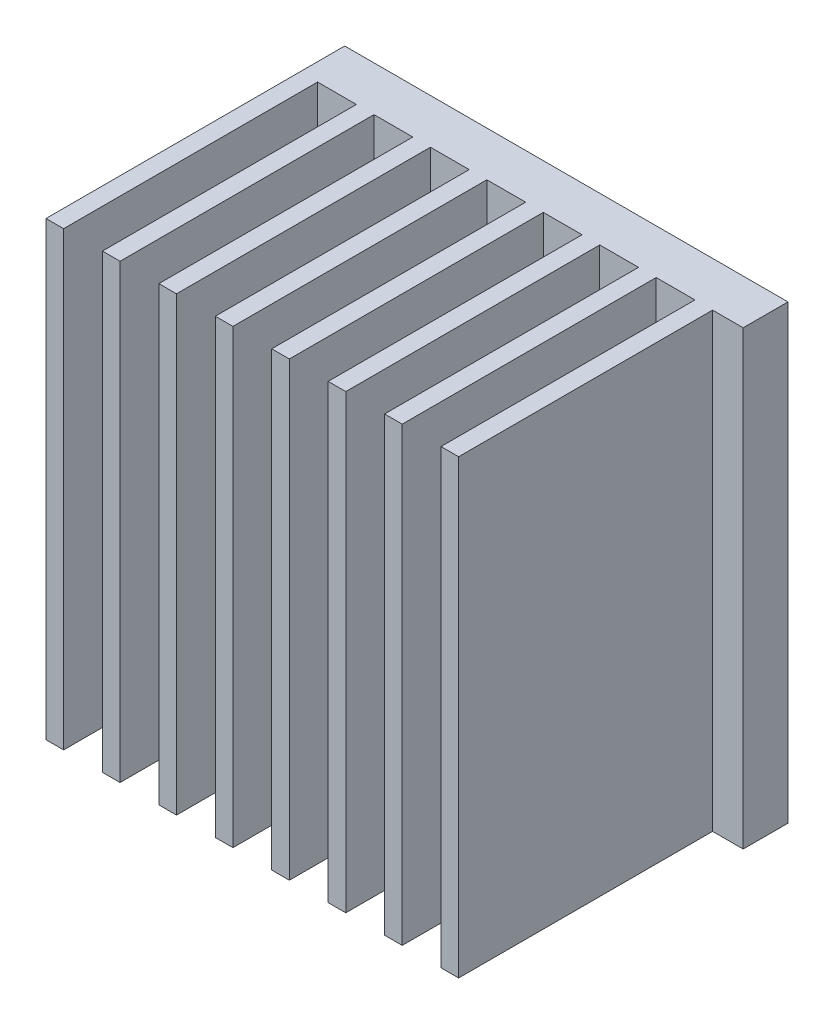
ISO-10303-21;
HEADER;
FILE_DESCRIPTION(('STEP AP214'),'2;1');
FILE_NAME('part.step','',(''),(''),'','','');
FILE_SCHEMA(('AUTOMOTIVE_DESIGN { 1 0 10303 214 1 1 1 1 }'));
ENDSEC;
DATA;
#1=APPLICATION_CONTEXT('core data for automotive mechanical design processes');
#2=APPLICATION_PROTOCOL_DEFINITION('international standard','automotive_design',2000,#1);
#3=PRODUCT_CONTEXT('',#1,'mechanical');
#4=PRODUCT('Part','Part','',(#3));
#5=PRODUCT_RELATED_PRODUCT_CATEGORY('part','',(#4));
#6=PRODUCT_DEFINITION_FORMATION('','',#4);
#7=PRODUCT_DEFINITION_CONTEXT('part definition',#1,'design');
#8=PRODUCT_DEFINITION('design','',#6,#7);
#9=PRODUCT_DEFINITION_SHAPE('','',#8);
#10=(LENGTH_UNIT() NAMED_UNIT(*) SI_UNIT(.MILLI.,.METRE.));
#11=(NAMED_UNIT(*) PLANE_ANGLE_UNIT() SI_UNIT($,.RADIAN.));
#12=(NAMED_UNIT(*) SI_UNIT($,.STERADIAN.) SOLID_ANGLE_UNIT());
#13=UNCERTAINTY_MEASURE_WITH_UNIT(LENGTH_MEASURE(1.E-05),#10,'distance_accuracy_value','');
#14=(GEOMETRIC_REPRESENTATION_CONTEXT(3) GLOBAL_UNCERTAINTY_ASSIGNED_CONTEXT((#13)) GLOBAL_UNIT_ASSIGNED_CONTEXT((#10,
#11,#12)) REPRESENTATION_CONTEXT('',''));
#15=CARTESIAN_POINT('',(0.,0.,0.));
#16=DIRECTION('',(0.,0.,1.));
#17=DIRECTION('',(1.,0.,0.));
#18=AXIS2_PLACEMENT_3D('',#15,#16,#17);
#19=CARTESIAN_POINT('',(0.,0.,3.175));
#20=DIRECTION('',(0.,0.,-1.));
#21=DIRECTION('',(-1.,0.,0.));
#22=AXIS2_PLACEMENT_3D('',#19,#20,#21);
#23=PLANE('',#22);
#24=DIRECTION('',(0.,-1.,0.));
#25=VECTOR('',#24,1.);
#26=CARTESIAN_POINT('',(12.29,16.,3.175));
#27=LINE('',#26,#25);
#28=CARTESIAN_POINT('',(12.29,16.,3.175));
#29=VERTEX_POINT('',#28);
#30=CARTESIAN_POINT('',(12.29,-16.,3.175));
#31=VERTEX_POINT('',#30);
#32=EDGE_CURVE('E58',#29,#31,#27,.T.);
#33=ORIENTED_EDGE('',*,*,#32,.F.);
#34=DIRECTION('',(-1.,0.,0.));
#35=VECTOR('',#34,1.);
#36=CARTESIAN_POINT('',(-15.71,16.,3.175));
#37=LINE('',#36,#35);
#38=CARTESIAN_POINT('',(9.54,16.,3.175));
#39=VERTEX_POINT('',#38);
#40=EDGE_CURVE('E480',#29,#39,#37,.T.);
#41=ORIENTED_EDGE('',*,*,#40,.T.);
#42=DIRECTION('',(0.,1.,0.));
#43=VECTOR('',#42,1.);
#44=CARTESIAN_POINT('',(9.53999999999999,16.,3.175));
#45=LINE('',#44,#43);
#46=CARTESIAN_POINT('',(9.54,-16.,3.175));
#47=VERTEX_POINT('',#46);
#48=EDGE_CURVE('E290',#47,#39,#45,.T.);
#49=ORIENTED_EDGE('',*,*,#48,.F.);
#50=DIRECTION('',(1.,0.,0.));
#51=VECTOR('',#50,1.);
#52=CARTESIAN_POINT('',(-15.71,-16.,3.175));
#53=LINE('',#52,#51);
#54=EDGE_CURVE('E513',#47,#31,#53,.T.);
#55=ORIENTED_EDGE('',*,*,#54,.T.);
#56=EDGE_LOOP('',(#33,#41,#49,#55));
#57=FACE_BOUND('',#56,.T.);
#58=ADVANCED_FACE('F43',(#57),#23,.F.);
#59=DIRECTION('',(0.,1.,0.));
#60=VECTOR('',#59,1.);
#61=CARTESIAN_POINT('',(13.54,16.,3.175));
#62=LINE('',#61,#60);
#63=CARTESIAN_POINT('',(13.54,-16.,3.175));
#64=VERTEX_POINT('',#63);
#65=CARTESIAN_POINT('',(13.54,16.,3.175));
#66=VERTEX_POINT('',#65);
#67=EDGE_CURVE('E284',#64,#66,#62,.T.);
#68=ORIENTED_EDGE('',*,*,#67,.F.);
#69=CARTESIAN_POINT('',(15.71,-16.,3.175));
#70=VERTEX_POINT('',#69);
#71=EDGE_CURVE('E479',#64,#70,#53,.T.);
#72=ORIENTED_EDGE('',*,*,#71,.T.);
#73=DIRECTION('',(0.,1.,0.));
#74=VECTOR('',#73,1.);
#75=CARTESIAN_POINT('',(15.71,-16.,3.175));
#76=LINE('',#75,#74);
#77=CARTESIAN_POINT('',(15.71,16.,3.175));
#78=VERTEX_POINT('',#77);
#79=EDGE_CURVE('E474',#70,#78,#76,.T.);
#80=ORIENTED_EDGE('',*,*,#79,.T.);
#81=EDGE_CURVE('E66',#78,#66,#37,.T.);
#82=ORIENTED_EDGE('',*,*,#81,.T.);
#83=EDGE_LOOP('',(#68,#72,#80,#82));
#84=FACE_BOUND('',#83,.T.);
#85=ADVANCED_FACE('F512',(#84),#23,.F.);
#86=DIRECTION('',(0.,-1.,0.));
#87=VECTOR('',#86,1.);
#88=CARTESIAN_POINT('',(8.29,16.,3.175));
#89=LINE('',#88,#87);
#90=CARTESIAN_POINT('',(8.29,16.,3.175));
#91=VERTEX_POINT('',#90);
#92=CARTESIAN_POINT('',(8.29,-16.,3.175));
#93=VERTEX_POINT('',#92);
#94=EDGE_CURVE('E287',#91,#93,#89,.T.);
#95=ORIENTED_EDGE('',*,*,#94,.F.);
#96=CARTESIAN_POINT('',(5.54,16.,3.175));
#97=VERTEX_POINT('',#96);
#98=EDGE_CURVE('E616',#91,#97,#37,.T.);
#99=ORIENTED_EDGE('',*,*,#98,.T.);
#100=DIRECTION('',(0.,1.,0.));
#101=VECTOR('',#100,1.);
#102=CARTESIAN_POINT('',(5.53999999999999,16.,3.175));
#103=LINE('',#102,#101);
#104=CARTESIAN_POINT('',(5.54,-16.,3.175));
#105=VERTEX_POINT('',#104);
#106=EDGE_CURVE('E324',#105,#97,#103,.T.);
#107=ORIENTED_EDGE('',*,*,#106,.F.);
#108=EDGE_CURVE('E514',#105,#93,#53,.T.);
#109=ORIENTED_EDGE('',*,*,#108,.T.);
#110=EDGE_LOOP('',(#95,#99,#107,#109));
#111=FACE_BOUND('',#110,.T.);
#112=ADVANCED_FACE('F580',(#111),#23,.F.);
#113=DIRECTION('',(0.,-1.,0.));
#114=VECTOR('',#113,1.);
#115=CARTESIAN_POINT('',(4.29,16.,3.175));
#116=LINE('',#115,#114);
#117=CARTESIAN_POINT('',(4.29,16.,3.175));
#118=VERTEX_POINT('',#117);
#119=CARTESIAN_POINT('',(4.29,-16.,3.175));
#120=VERTEX_POINT('',#119);
#121=EDGE_CURVE('E319',#118,#120,#116,.T.);
#122=ORIENTED_EDGE('',*,*,#121,.F.);
#123=CARTESIAN_POINT('',(1.54,16.,3.175));
#124=VERTEX_POINT('',#123);
#125=EDGE_CURVE('E615',#118,#124,#37,.T.);
#126=ORIENTED_EDGE('',*,*,#125,.T.);
#127=DIRECTION('',(0.,1.,0.));
#128=VECTOR('',#127,1.);
#129=CARTESIAN_POINT('',(1.53999999999999,16.,3.175));
#130=LINE('',#129,#128);
#131=CARTESIAN_POINT('',(1.54,-16.,3.175));
#132=VERTEX_POINT('',#131);
#133=EDGE_CURVE('E351',#132,#124,#130,.T.);
#134=ORIENTED_EDGE('',*,*,#133,.F.);
#135=EDGE_CURVE('E516',#132,#120,#53,.T.);
#136=ORIENTED_EDGE('',*,*,#135,.T.);
#137=EDGE_LOOP('',(#122,#126,#134,#136));
#138=FACE_BOUND('',#137,.T.);
#139=ADVANCED_FACE('F597',(#138),#23,.F.);
#140=DIRECTION('',(0.,-1.,0.));
#141=VECTOR('',#140,1.);
#142=CARTESIAN_POINT('',(0.289999999999995,16.,3.175));
#143=LINE('',#142,#141);
#144=CARTESIAN_POINT('',(0.289999999999995,16.,3.175));
#145=VERTEX_POINT('',#144);
#146=CARTESIAN_POINT('',(0.289999999999995,-16.,3.175));
#147=VERTEX_POINT('',#146);
#148=EDGE_CURVE('E346',#145,#147,#143,.T.);
#149=ORIENTED_EDGE('',*,*,#148,.F.);
#150=CARTESIAN_POINT('',(-2.46,16.,3.175));
#151=VERTEX_POINT('',#150);
#152=EDGE_CURVE('E544',#145,#151,#37,.T.);
#153=ORIENTED_EDGE('',*,*,#152,.T.);
#154=DIRECTION('',(0.,1.,0.));
#155=VECTOR('',#154,1.);
#156=CARTESIAN_POINT('',(-2.46000000000001,16.,3.175));
#157=LINE('',#156,#155);
#158=CARTESIAN_POINT('',(-2.46,-16.,3.175));
#159=VERTEX_POINT('',#158);
#160=EDGE_CURVE('E378',#159,#151,#157,.T.);
#161=ORIENTED_EDGE('',*,*,#160,.F.);
#162=EDGE_CURVE('E519',#159,#147,#53,.T.);
#163=ORIENTED_EDGE('',*,*,#162,.T.);
#164=EDGE_LOOP('',(#149,#153,#161,#163));
#165=FACE_BOUND('',#164,.T.);
#166=ADVANCED_FACE('F593',(#165),#23,.F.);
#167=DIRECTION('',(0.,-1.,0.));
#168=VECTOR('',#167,1.);
#169=CARTESIAN_POINT('',(-3.71,16.,3.175));
#170=LINE('',#169,#168);
#171=CARTESIAN_POINT('',(-3.71,16.,3.175));
#172=VERTEX_POINT('',#171);
#173=CARTESIAN_POINT('',(-3.71,-16.,3.175));
#174=VERTEX_POINT('',#173);
#175=EDGE_CURVE('E373',#172,#174,#170,.T.);
#176=ORIENTED_EDGE('',*,*,#175,.F.);
#177=CARTESIAN_POINT('',(-6.46,16.,3.175));
#178=VERTEX_POINT('',#177);
#179=EDGE_CURVE('E543',#172,#178,#37,.T.);
#180=ORIENTED_EDGE('',*,*,#179,.T.);
#181=DIRECTION('',(0.,1.,0.));
#182=VECTOR('',#181,1.);
#183=CARTESIAN_POINT('',(-6.46000000000001,16.,3.175));
#184=LINE('',#183,#182);
#185=CARTESIAN_POINT('',(-6.46,-16.,3.175));
#186=VERTEX_POINT('',#185);
#187=EDGE_CURVE('E405',#186,#178,#184,.T.);
#188=ORIENTED_EDGE('',*,*,#187,.F.);
#189=EDGE_CURVE('E522',#186,#174,#53,.T.);
#190=ORIENTED_EDGE('',*,*,#189,.T.);
#191=EDGE_LOOP('',(#176,#180,#188,#190));
#192=FACE_BOUND('',#191,.T.);
#193=ADVANCED_FACE('F589',(#192),#23,.F.);
#194=DIRECTION('',(0.,-1.,0.));
#195=VECTOR('',#194,1.);
#196=CARTESIAN_POINT('',(-7.71000000000001,16.,3.175));
#197=LINE('',#196,#195);
#198=CARTESIAN_POINT('',(-7.71000000000001,16.,3.175));
#199=VERTEX_POINT('',#198);
#200=CARTESIAN_POINT('',(-7.71000000000001,-16.,3.175));
#201=VERTEX_POINT('',#200);
#202=EDGE_CURVE('E400',#199,#201,#197,.T.);
#203=ORIENTED_EDGE('',*,*,#202,.F.);
#204=CARTESIAN_POINT('',(-10.46,16.,3.175));
#205=VERTEX_POINT('',#204);
#206=EDGE_CURVE('E540',#199,#205,#37,.T.);
#207=ORIENTED_EDGE('',*,*,#206,.T.);
#208=DIRECTION('',(0.,1.,0.));
#209=VECTOR('',#208,1.);
#210=CARTESIAN_POINT('',(-10.46,16.,3.175));
#211=LINE('',#210,#209);
#212=CARTESIAN_POINT('',(-10.46,-16.,3.175));
#213=VERTEX_POINT('',#212);
#214=EDGE_CURVE('E432',#213,#205,#211,.T.);
#215=ORIENTED_EDGE('',*,*,#214,.F.);
#216=EDGE_CURVE('E484',#213,#201,#53,.T.);
#217=ORIENTED_EDGE('',*,*,#216,.T.);
#218=EDGE_LOOP('',(#203,#207,#215,#217));
#219=FACE_BOUND('',#218,.T.);
#220=ADVANCED_FACE('F529',(#219),#23,.F.);
#221=DIRECTION('',(0.,-1.,0.));
#222=VECTOR('',#221,1.);
#223=CARTESIAN_POINT('',(-11.71,16.,3.175));
#224=LINE('',#223,#222);
#225=CARTESIAN_POINT('',(-11.71,16.,3.175));
#226=VERTEX_POINT('',#225);
#227=CARTESIAN_POINT('',(-11.71,-16.,3.175));
#228=VERTEX_POINT('',#227);
#229=EDGE_CURVE('E427',#226,#228,#224,.T.);
#230=ORIENTED_EDGE('',*,*,#229,.F.);
#231=CARTESIAN_POINT('',(-14.46,16.,3.175));
#232=VERTEX_POINT('',#231);
#233=EDGE_CURVE('E476',#226,#232,#37,.T.);
#234=ORIENTED_EDGE('',*,*,#233,.T.);
#235=DIRECTION('',(0.,1.,0.));
#236=VECTOR('',#235,1.);
#237=CARTESIAN_POINT('',(-14.46,16.,3.175));
#238=LINE('',#237,#236);
#239=CARTESIAN_POINT('',(-14.46,-16.,3.175));
#240=VERTEX_POINT('',#239);
#241=EDGE_CURVE('E454',#240,#232,#238,.T.);
#242=ORIENTED_EDGE('',*,*,#241,.F.);
#243=EDGE_CURVE('E481',#240,#228,#53,.T.);
#244=ORIENTED_EDGE('',*,*,#243,.T.);
#245=EDGE_LOOP('',(#230,#234,#242,#244));
#246=FACE_BOUND('',#245,.T.);
#247=ADVANCED_FACE('F547',(#246),#23,.F.);
#248=CARTESIAN_POINT('',(15.71,-16.,3.175));
#249=DIRECTION('',(-1.,0.,0.));
#250=DIRECTION('',(0.,0.,1.));
#251=AXIS2_PLACEMENT_3D('',#248,#249,#250);
#252=PLANE('',#251);
#253=DIRECTION('',(0.,1.,0.));
#254=VECTOR('',#253,1.);
#255=CARTESIAN_POINT('',(15.71,-16.,0.));
#256=LINE('',#255,#254);
#257=CARTESIAN_POINT('',(15.71,-16.,0.));
#258=VERTEX_POINT('',#257);
#259=CARTESIAN_POINT('',(15.71,16.,0.));
#260=VERTEX_POINT('',#259);
#261=EDGE_CURVE('E473',#258,#260,#256,.T.);
#262=ORIENTED_EDGE('',*,*,#261,.T.);
#263=DIRECTION('',(0.,0.,-1.));
#264=VECTOR('',#263,1.);
#265=CARTESIAN_POINT('',(15.71,16.,3.175));
#266=LINE('',#265,#264);
#267=EDGE_CURVE('E11',#78,#260,#266,.T.);
#268=ORIENTED_EDGE('',*,*,#267,.F.);
#269=ORIENTED_EDGE('',*,*,#79,.F.);
#270=DIRECTION('',(0.,0.,-1.));
#271=VECTOR('',#270,1.);
#272=CARTESIAN_POINT('',(15.71,-16.,3.175));
#273=LINE('',#272,#271);
#274=EDGE_CURVE('E483',#70,#258,#273,.T.);
#275=ORIENTED_EDGE('',*,*,#274,.T.);
#276=EDGE_LOOP('',(#262,#268,#269,#275));
#277=FACE_BOUND('',#276,.T.);
#278=ADVANCED_FACE('F45',(#277),#252,.F.);
#279=CARTESIAN_POINT('',(-15.71,16.,3.175));
#280=DIRECTION('',(0.,-1.,0.));
#281=DIRECTION('',(0.,0.,-1.));
#282=AXIS2_PLACEMENT_3D('',#279,#280,#281);
#283=PLANE('',#282);
#284=DIRECTION('',(-1.,0.,0.));
#285=VECTOR('',#284,1.);
#286=CARTESIAN_POINT('',(-15.71,16.,0.));
#287=LINE('',#286,#285);
#288=CARTESIAN_POINT('',(-15.71,16.,0.));
#289=VERTEX_POINT('',#288);
#290=EDGE_CURVE('E487',#260,#289,#287,.T.);
#291=ORIENTED_EDGE('',*,*,#290,.T.);
#292=DIRECTION('',(0.,0.,-1.));
#293=VECTOR('',#292,1.);
#294=CARTESIAN_POINT('',(-15.71,16.,3.175));
#295=LINE('',#294,#293);
#296=CARTESIAN_POINT('',(-15.71,16.,21.175));
#297=VERTEX_POINT('',#296);
#298=EDGE_CURVE('E51',#297,#289,#295,.T.);
#299=ORIENTED_EDGE('',*,*,#298,.F.);
#300=DIRECTION('',(-1.,0.,0.));
#301=VECTOR('',#300,1.);
#302=CARTESIAN_POINT('',(-15.71,16.,21.175));
#303=LINE('',#302,#301);
#304=CARTESIAN_POINT('',(-14.46,16.,21.175));
#305=VERTEX_POINT('',#304);
#306=EDGE_CURVE('E462',#305,#297,#303,.T.);
#307=ORIENTED_EDGE('',*,*,#306,.F.);
#308=DIRECTION('',(0.,0.,-1.));
#309=VECTOR('',#308,1.);
#310=CARTESIAN_POINT('',(-14.46,16.,21.175));
#311=LINE('',#310,#309);
#312=EDGE_CURVE('E465',#305,#232,#311,.T.);
#313=ORIENTED_EDGE('',*,*,#312,.T.);
#314=ORIENTED_EDGE('',*,*,#233,.F.);
#315=DIRECTION('',(0.,0.,-1.));
#316=VECTOR('',#315,1.);
#317=CARTESIAN_POINT('',(-11.71,16.,21.175));
#318=LINE('',#317,#316);
#319=CARTESIAN_POINT('',(-11.71,16.,21.175));
#320=VERTEX_POINT('',#319);
#321=EDGE_CURVE('E438',#320,#226,#318,.T.);
#322=ORIENTED_EDGE('',*,*,#321,.F.);
#323=DIRECTION('',(-1.,0.,0.));
#324=VECTOR('',#323,1.);
#325=CARTESIAN_POINT('',(-11.71,16.,21.175));
#326=LINE('',#325,#324);
#327=CARTESIAN_POINT('',(-10.46,16.,21.175));
#328=VERTEX_POINT('',#327);
#329=EDGE_CURVE('E436',#328,#320,#326,.T.);
#330=ORIENTED_EDGE('',*,*,#329,.F.);
#331=DIRECTION('',(0.,0.,-1.));
#332=VECTOR('',#331,1.);
#333=CARTESIAN_POINT('',(-10.46,16.,21.175));
#334=LINE('',#333,#332);
#335=EDGE_CURVE('E445',#328,#205,#334,.T.);
#336=ORIENTED_EDGE('',*,*,#335,.T.);
#337=ORIENTED_EDGE('',*,*,#206,.F.);
#338=DIRECTION('',(0.,0.,-1.));
#339=VECTOR('',#338,1.);
#340=CARTESIAN_POINT('',(-7.71000000000001,16.,21.175));
#341=LINE('',#340,#339);
#342=CARTESIAN_POINT('',(-7.71000000000001,16.,21.175));
#343=VERTEX_POINT('',#342);
#344=EDGE_CURVE('E411',#343,#199,#341,.T.);
#345=ORIENTED_EDGE('',*,*,#344,.F.);
#346=DIRECTION('',(-1.,0.,0.));
#347=VECTOR('',#346,1.);
#348=CARTESIAN_POINT('',(-7.71000000000001,16.,21.175));
#349=LINE('',#348,#347);
#350=CARTESIAN_POINT('',(-6.46000000000001,16.,21.175));
#351=VERTEX_POINT('',#350);
#352=EDGE_CURVE('E409',#351,#343,#349,.T.);
#353=ORIENTED_EDGE('',*,*,#352,.F.);
#354=DIRECTION('',(0.,0.,-1.));
#355=VECTOR('',#354,1.);
#356=CARTESIAN_POINT('',(-6.46000000000001,16.,21.175));
#357=LINE('',#356,#355);
#358=EDGE_CURVE('E418',#351,#178,#357,.T.);
#359=ORIENTED_EDGE('',*,*,#358,.T.);
#360=ORIENTED_EDGE('',*,*,#179,.F.);
#361=DIRECTION('',(0.,0.,-1.));
#362=VECTOR('',#361,1.);
#363=CARTESIAN_POINT('',(-3.71,16.,21.175));
#364=LINE('',#363,#362);
#365=CARTESIAN_POINT('',(-3.71,16.,21.175));
#366=VERTEX_POINT('',#365);
#367=EDGE_CURVE('E384',#366,#172,#364,.T.);
#368=ORIENTED_EDGE('',*,*,#367,.F.);
#369=DIRECTION('',(-1.,0.,0.));
#370=VECTOR('',#369,1.);
#371=CARTESIAN_POINT('',(-3.71,16.,21.175));
#372=LINE('',#371,#370);
#373=CARTESIAN_POINT('',(-2.46000000000001,16.,21.175));
#374=VERTEX_POINT('',#373);
#375=EDGE_CURVE('E382',#374,#366,#372,.T.);
#376=ORIENTED_EDGE('',*,*,#375,.F.);
#377=DIRECTION('',(0.,0.,-1.));
#378=VECTOR('',#377,1.);
#379=CARTESIAN_POINT('',(-2.46000000000001,16.,21.175));
#380=LINE('',#379,#378);
#381=EDGE_CURVE('E391',#374,#151,#380,.T.);
#382=ORIENTED_EDGE('',*,*,#381,.T.);
#383=ORIENTED_EDGE('',*,*,#152,.F.);
#384=DIRECTION('',(0.,0.,-1.));
#385=VECTOR('',#384,1.);
#386=CARTESIAN_POINT('',(0.289999999999995,16.,21.175));
#387=LINE('',#386,#385);
#388=CARTESIAN_POINT('',(0.289999999999995,16.,21.175));
#389=VERTEX_POINT('',#388);
#390=EDGE_CURVE('E357',#389,#145,#387,.T.);
#391=ORIENTED_EDGE('',*,*,#390,.F.);
#392=DIRECTION('',(-1.,0.,0.));
#393=VECTOR('',#392,1.);
#394=CARTESIAN_POINT('',(0.289999999999995,16.,21.175));
#395=LINE('',#394,#393);
#396=CARTESIAN_POINT('',(1.53999999999999,16.,21.175));
#397=VERTEX_POINT('',#396);
#398=EDGE_CURVE('E355',#397,#389,#395,.T.);
#399=ORIENTED_EDGE('',*,*,#398,.F.);
#400=DIRECTION('',(0.,0.,-1.));
#401=VECTOR('',#400,1.);
#402=CARTESIAN_POINT('',(1.53999999999999,16.,21.175));
#403=LINE('',#402,#401);
#404=EDGE_CURVE('E364',#397,#124,#403,.T.);
#405=ORIENTED_EDGE('',*,*,#404,.T.);
#406=ORIENTED_EDGE('',*,*,#125,.F.);
#407=DIRECTION('',(0.,0.,-1.));
#408=VECTOR('',#407,1.);
#409=CARTESIAN_POINT('',(4.29,16.,21.175));
#410=LINE('',#409,#408);
#411=CARTESIAN_POINT('',(4.29,16.,21.175));
#412=VERTEX_POINT('',#411);
#413=EDGE_CURVE('E330',#412,#118,#410,.T.);
#414=ORIENTED_EDGE('',*,*,#413,.F.);
#415=DIRECTION('',(-1.,0.,0.));
#416=VECTOR('',#415,1.);
#417=CARTESIAN_POINT('',(4.29,16.,21.175));
#418=LINE('',#417,#416);
#419=CARTESIAN_POINT('',(5.53999999999999,16.,21.175));
#420=VERTEX_POINT('',#419);
#421=EDGE_CURVE('E328',#420,#412,#418,.T.);
#422=ORIENTED_EDGE('',*,*,#421,.F.);
#423=DIRECTION('',(0.,0.,-1.));
#424=VECTOR('',#423,1.);
#425=CARTESIAN_POINT('',(5.53999999999999,16.,21.175));
#426=LINE('',#425,#424);
#427=EDGE_CURVE('E337',#420,#97,#426,.T.);
#428=ORIENTED_EDGE('',*,*,#427,.T.);
#429=ORIENTED_EDGE('',*,*,#98,.F.);
#430=DIRECTION('',(0.,0.,-1.));
#431=VECTOR('',#430,1.);
#432=CARTESIAN_POINT('',(8.29,16.,21.175));
#433=LINE('',#432,#431);
#434=CARTESIAN_POINT('',(8.29,16.,21.175));
#435=VERTEX_POINT('',#434);
#436=EDGE_CURVE('E304',#435,#91,#433,.T.);
#437=ORIENTED_EDGE('',*,*,#436,.F.);
#438=DIRECTION('',(-1.,0.,0.));
#439=VECTOR('',#438,1.);
#440=CARTESIAN_POINT('',(8.29,16.,21.175));
#441=LINE('',#440,#439);
#442=CARTESIAN_POINT('',(9.53999999999999,16.,21.175));
#443=VERTEX_POINT('',#442);
#444=EDGE_CURVE('E303',#443,#435,#441,.T.);
#445=ORIENTED_EDGE('',*,*,#444,.F.);
#446=DIRECTION('',(0.,0.,-1.));
#447=VECTOR('',#446,1.);
#448=CARTESIAN_POINT('',(9.53999999999999,16.,21.175));
#449=LINE('',#448,#447);
#450=EDGE_CURVE('E310',#443,#39,#449,.T.);
#451=ORIENTED_EDGE('',*,*,#450,.T.);
#452=ORIENTED_EDGE('',*,*,#40,.F.);
#453=DIRECTION('',(0.,0.,-1.));
#454=VECTOR('',#453,1.);
#455=CARTESIAN_POINT('',(12.29,16.,21.175));
#456=LINE('',#455,#454);
#457=CARTESIAN_POINT('',(12.29,16.,21.175));
#458=VERTEX_POINT('',#457);
#459=EDGE_CURVE('E807',#458,#29,#456,.T.);
#460=ORIENTED_EDGE('',*,*,#459,.F.);
#461=DIRECTION('',(-1.,0.,0.));
#462=VECTOR('',#461,1.);
#463=CARTESIAN_POINT('',(12.29,16.,21.175));
#464=LINE('',#463,#462);
#465=CARTESIAN_POINT('',(13.54,16.,21.175));
#466=VERTEX_POINT('',#465);
#467=EDGE_CURVE('E280',#466,#458,#464,.T.);
#468=ORIENTED_EDGE('',*,*,#467,.F.);
#469=DIRECTION('',(0.,0.,-1.));
#470=VECTOR('',#469,1.);
#471=CARTESIAN_POINT('',(13.54,16.,21.175));
#472=LINE('',#471,#470);
#473=EDGE_CURVE('E292',#466,#66,#472,.T.);
#474=ORIENTED_EDGE('',*,*,#473,.T.);
#475=ORIENTED_EDGE('',*,*,#81,.F.);
#476=ORIENTED_EDGE('',*,*,#267,.T.);
#477=EDGE_LOOP('',(#291,#299,#307,#313,#314,#322,#330,#336,#337,#345,#353,#359,#360,#368,#376,
#382,#383,#391,#399,#405,#406,#414,#422,#428,#429,#437,#445,#451,#452,#460,#468,#474,#475,#476));
#478=FACE_BOUND('',#477,.T.);
#479=ADVANCED_FACE('F539',(#478),#283,.F.);
#480=CARTESIAN_POINT('',(-15.71,-16.,3.175));
#481=DIRECTION('',(1.,0.,0.));
#482=DIRECTION('',(0.,0.,-1.));
#483=AXIS2_PLACEMENT_3D('',#480,#481,#482);
#484=PLANE('',#483);
#485=DIRECTION('',(0.,-1.,0.));
#486=VECTOR('',#485,1.);
#487=CARTESIAN_POINT('',(-15.71,-16.,0.));
#488=LINE('',#487,#486);
#489=CARTESIAN_POINT('',(-15.71,-16.,0.));
#490=VERTEX_POINT('',#489);
#491=EDGE_CURVE('E489',#289,#490,#488,.T.);
#492=ORIENTED_EDGE('',*,*,#491,.T.);
#493=DIRECTION('',(0.,0.,-1.));
#494=VECTOR('',#493,1.);
#495=CARTESIAN_POINT('',(-15.71,-16.,3.175));
#496=LINE('',#495,#494);
#497=CARTESIAN_POINT('',(-15.71,-16.,21.175));
#498=VERTEX_POINT('',#497);
#499=EDGE_CURVE('E494',#498,#490,#496,.T.);
#500=ORIENTED_EDGE('',*,*,#499,.F.);
#501=DIRECTION('',(0.,-1.,0.));
#502=VECTOR('',#501,1.);
#503=CARTESIAN_POINT('',(-15.71,16.,21.175));
#504=LINE('',#503,#502);
#505=EDGE_CURVE('E455',#297,#498,#504,.T.);
#506=ORIENTED_EDGE('',*,*,#505,.F.);
#507=ORIENTED_EDGE('',*,*,#298,.T.);
#508=EDGE_LOOP('',(#492,#500,#506,#507));
#509=FACE_BOUND('',#508,.T.);
#510=ADVANCED_FACE('F500',(#509),#484,.F.);
#511=CARTESIAN_POINT('',(-15.71,-16.,3.175));
#512=DIRECTION('',(0.,1.,0.));
#513=DIRECTION('',(0.,0.,1.));
#514=AXIS2_PLACEMENT_3D('',#511,#512,#513);
#515=PLANE('',#514);
#516=DIRECTION('',(1.,0.,0.));
#517=VECTOR('',#516,1.);
#518=CARTESIAN_POINT('',(-15.71,-16.,0.));
#519=LINE('',#518,#517);
#520=EDGE_CURVE('E477',#490,#258,#519,.T.);
#521=ORIENTED_EDGE('',*,*,#520,.T.);
#522=ORIENTED_EDGE('',*,*,#274,.F.);
#523=ORIENTED_EDGE('',*,*,#71,.F.);
#524=DIRECTION('',(0.,0.,-1.));
#525=VECTOR('',#524,1.);
#526=CARTESIAN_POINT('',(13.54,-16.,21.175));
#527=LINE('',#526,#525);
#528=CARTESIAN_POINT('',(13.54,-16.,21.175));
#529=VERTEX_POINT('',#528);
#530=EDGE_CURVE('E271',#529,#64,#527,.T.);
#531=ORIENTED_EDGE('',*,*,#530,.F.);
#532=DIRECTION('',(1.,0.,0.));
#533=VECTOR('',#532,1.);
#534=CARTESIAN_POINT('',(12.29,-16.,21.175));
#535=LINE('',#534,#533);
#536=CARTESIAN_POINT('',(12.29,-16.,21.175));
#537=VERTEX_POINT('',#536);
#538=EDGE_CURVE('E265',#537,#529,#535,.T.);
#539=ORIENTED_EDGE('',*,*,#538,.F.);
#540=DIRECTION('',(0.,0.,-1.));
#541=VECTOR('',#540,1.);
#542=CARTESIAN_POINT('',(12.29,-16.,21.175));
#543=LINE('',#542,#541);
#544=EDGE_CURVE('E269',#537,#31,#543,.T.);
#545=ORIENTED_EDGE('',*,*,#544,.T.);
#546=ORIENTED_EDGE('',*,*,#54,.F.);
#547=DIRECTION('',(0.,0.,-1.));
#548=VECTOR('',#547,1.);
#549=CARTESIAN_POINT('',(9.54,-16.,21.175));
#550=LINE('',#549,#548);
#551=CARTESIAN_POINT('',(9.54,-16.,21.175));
#552=VERTEX_POINT('',#551);
#553=EDGE_CURVE('E313',#552,#47,#550,.T.);
#554=ORIENTED_EDGE('',*,*,#553,.F.);
#555=DIRECTION('',(1.,0.,0.));
#556=VECTOR('',#555,1.);
#557=CARTESIAN_POINT('',(8.29,-16.,21.175));
#558=LINE('',#557,#556);
#559=CARTESIAN_POINT('',(8.29,-16.,21.175));
#560=VERTEX_POINT('',#559);
#561=EDGE_CURVE('E299',#560,#552,#558,.T.);
#562=ORIENTED_EDGE('',*,*,#561,.F.);
#563=DIRECTION('',(0.,0.,-1.));
#564=VECTOR('',#563,1.);
#565=CARTESIAN_POINT('',(8.29,-16.,21.175));
#566=LINE('',#565,#564);
#567=EDGE_CURVE('E316',#560,#93,#566,.T.);
#568=ORIENTED_EDGE('',*,*,#567,.T.);
#569=ORIENTED_EDGE('',*,*,#108,.F.);
#570=DIRECTION('',(0.,0.,-1.));
#571=VECTOR('',#570,1.);
#572=CARTESIAN_POINT('',(5.54,-16.,21.175));
#573=LINE('',#572,#571);
#574=CARTESIAN_POINT('',(5.54,-16.,21.175));
#575=VERTEX_POINT('',#574);
#576=EDGE_CURVE('E340',#575,#105,#573,.T.);
#577=ORIENTED_EDGE('',*,*,#576,.F.);
#578=DIRECTION('',(1.,0.,0.));
#579=VECTOR('',#578,1.);
#580=CARTESIAN_POINT('',(4.29,-16.,21.175));
#581=LINE('',#580,#579);
#582=CARTESIAN_POINT('',(4.29,-16.,21.175));
#583=VERTEX_POINT('',#582);
#584=EDGE_CURVE('E323',#583,#575,#581,.T.);
#585=ORIENTED_EDGE('',*,*,#584,.F.);
#586=DIRECTION('',(0.,0.,-1.));
#587=VECTOR('',#586,1.);
#588=CARTESIAN_POINT('',(4.29,-16.,21.175));
#589=LINE('',#588,#587);
#590=EDGE_CURVE('E343',#583,#120,#589,.T.);
#591=ORIENTED_EDGE('',*,*,#590,.T.);
#592=ORIENTED_EDGE('',*,*,#135,.F.);
#593=DIRECTION('',(0.,0.,-1.));
#594=VECTOR('',#593,1.);
#595=CARTESIAN_POINT('',(1.54,-16.,21.175));
#596=LINE('',#595,#594);
#597=CARTESIAN_POINT('',(1.54,-16.,21.175));
#598=VERTEX_POINT('',#597);
#599=EDGE_CURVE('E367',#598,#132,#596,.T.);
#600=ORIENTED_EDGE('',*,*,#599,.F.);
#601=DIRECTION('',(1.,0.,0.));
#602=VECTOR('',#601,1.);
#603=CARTESIAN_POINT('',(0.289999999999995,-16.,21.175));
#604=LINE('',#603,#602);
#605=CARTESIAN_POINT('',(0.289999999999995,-16.,21.175));
#606=VERTEX_POINT('',#605);
#607=EDGE_CURVE('E350',#606,#598,#604,.T.);
#608=ORIENTED_EDGE('',*,*,#607,.F.);
#609=DIRECTION('',(0.,0.,-1.));
#610=VECTOR('',#609,1.);
#611=CARTESIAN_POINT('',(0.289999999999995,-16.,21.175));
#612=LINE('',#611,#610);
#613=EDGE_CURVE('E370',#606,#147,#612,.T.);
#614=ORIENTED_EDGE('',*,*,#613,.T.);
#615=ORIENTED_EDGE('',*,*,#162,.F.);
#616=DIRECTION('',(0.,0.,-1.));
#617=VECTOR('',#616,1.);
#618=CARTESIAN_POINT('',(-2.46,-16.,21.175));
#619=LINE('',#618,#617);
#620=CARTESIAN_POINT('',(-2.46,-16.,21.175));
#621=VERTEX_POINT('',#620);
#622=EDGE_CURVE('E394',#621,#159,#619,.T.);
#623=ORIENTED_EDGE('',*,*,#622,.F.);
#624=DIRECTION('',(1.,0.,0.));
#625=VECTOR('',#624,1.);
#626=CARTESIAN_POINT('',(-3.71,-16.,21.175));
#627=LINE('',#626,#625);
#628=CARTESIAN_POINT('',(-3.71,-16.,21.175));
#629=VERTEX_POINT('',#628);
#630=EDGE_CURVE('E377',#629,#621,#627,.T.);
#631=ORIENTED_EDGE('',*,*,#630,.F.);
#632=DIRECTION('',(0.,0.,-1.));
#633=VECTOR('',#632,1.);
#634=CARTESIAN_POINT('',(-3.71,-16.,21.175));
#635=LINE('',#634,#633);
#636=EDGE_CURVE('E397',#629,#174,#635,.T.);
#637=ORIENTED_EDGE('',*,*,#636,.T.);
#638=ORIENTED_EDGE('',*,*,#189,.F.);
#639=DIRECTION('',(0.,0.,-1.));
#640=VECTOR('',#639,1.);
#641=CARTESIAN_POINT('',(-6.46,-16.,21.175));
#642=LINE('',#641,#640);
#643=CARTESIAN_POINT('',(-6.46,-16.,21.175));
#644=VERTEX_POINT('',#643);
#645=EDGE_CURVE('E421',#644,#186,#642,.T.);
#646=ORIENTED_EDGE('',*,*,#645,.F.);
#647=DIRECTION('',(1.,0.,0.));
#648=VECTOR('',#647,1.);
#649=CARTESIAN_POINT('',(-7.71000000000001,-16.,21.175));
#650=LINE('',#649,#648);
#651=CARTESIAN_POINT('',(-7.71000000000001,-16.,21.175));
#652=VERTEX_POINT('',#651);
#653=EDGE_CURVE('E404',#652,#644,#650,.T.);
#654=ORIENTED_EDGE('',*,*,#653,.F.);
#655=DIRECTION('',(0.,0.,-1.));
#656=VECTOR('',#655,1.);
#657=CARTESIAN_POINT('',(-7.71000000000001,-16.,21.175));
#658=LINE('',#657,#656);
#659=EDGE_CURVE('E424',#652,#201,#658,.T.);
#660=ORIENTED_EDGE('',*,*,#659,.T.);
#661=ORIENTED_EDGE('',*,*,#216,.F.);
#662=DIRECTION('',(0.,0.,-1.));
#663=VECTOR('',#662,1.);
#664=CARTESIAN_POINT('',(-10.46,-16.,21.175));
#665=LINE('',#664,#663);
#666=CARTESIAN_POINT('',(-10.46,-16.,21.175));
#667=VERTEX_POINT('',#666);
#668=EDGE_CURVE('E448',#667,#213,#665,.T.);
#669=ORIENTED_EDGE('',*,*,#668,.F.);
#670=DIRECTION('',(1.,0.,0.));
#671=VECTOR('',#670,1.);
#672=CARTESIAN_POINT('',(-11.71,-16.,21.175));
#673=LINE('',#672,#671);
#674=CARTESIAN_POINT('',(-11.71,-16.,21.175));
#675=VERTEX_POINT('',#674);
#676=EDGE_CURVE('E431',#675,#667,#673,.T.);
#677=ORIENTED_EDGE('',*,*,#676,.F.);
#678=DIRECTION('',(0.,0.,-1.));
#679=VECTOR('',#678,1.);
#680=CARTESIAN_POINT('',(-11.71,-16.,21.175));
#681=LINE('',#680,#679);
#682=EDGE_CURVE('E451',#675,#228,#681,.T.);
#683=ORIENTED_EDGE('',*,*,#682,.T.);
#684=ORIENTED_EDGE('',*,*,#243,.F.);
#685=DIRECTION('',(0.,0.,-1.));
#686=VECTOR('',#685,1.);
#687=CARTESIAN_POINT('',(-14.46,-16.,21.175));
#688=LINE('',#687,#686);
#689=CARTESIAN_POINT('',(-14.46,-16.,21.175));
#690=VERTEX_POINT('',#689);
#691=EDGE_CURVE('E470',#690,#240,#688,.T.);
#692=ORIENTED_EDGE('',*,*,#691,.F.);
#693=DIRECTION('',(1.,0.,0.));
#694=VECTOR('',#693,1.);
#695=CARTESIAN_POINT('',(-15.71,-16.,21.175));
#696=LINE('',#695,#694);
#697=EDGE_CURVE('E458',#498,#690,#696,.T.);
#698=ORIENTED_EDGE('',*,*,#697,.F.);
#699=ORIENTED_EDGE('',*,*,#499,.T.);
#700=EDGE_LOOP('',(#521,#522,#523,#531,#539,#545,#546,#554,#562,#568,#569,#577,#585,#591,#592,
#600,#608,#614,#615,#623,#631,#637,#638,#646,#654,#660,#661,#669,#677,#683,#684,#692,#698,#699));
#701=FACE_BOUND('',#700,.T.);
#702=ADVANCED_FACE('F267',(#701),#515,.F.);
#703=CARTESIAN_POINT('',(0.,0.,0.));
#704=DIRECTION('',(0.,0.,-1.));
#705=DIRECTION('',(-1.,0.,0.));
#706=AXIS2_PLACEMENT_3D('',#703,#704,#705);
#707=PLANE('',#706);
#708=ORIENTED_EDGE('',*,*,#261,.F.);
#709=ORIENTED_EDGE('',*,*,#520,.F.);
#710=ORIENTED_EDGE('',*,*,#491,.F.);
#711=ORIENTED_EDGE('',*,*,#290,.F.);
#712=EDGE_LOOP('',(#708,#709,#710,#711));
#713=FACE_BOUND('',#712,.T.);
#714=ADVANCED_FACE('F506',(#713),#707,.T.);
#715=CARTESIAN_POINT('',(-14.46,16.,21.175));
#716=DIRECTION('',(-1.,0.,0.));
#717=DIRECTION('',(0.,-1.,0.));
#718=AXIS2_PLACEMENT_3D('',#715,#716,#717);
#719=PLANE('',#718);
#720=ORIENTED_EDGE('',*,*,#241,.T.);
#721=ORIENTED_EDGE('',*,*,#312,.F.);
#722=DIRECTION('',(0.,1.,0.));
#723=VECTOR('',#722,1.);
#724=CARTESIAN_POINT('',(-14.46,16.,21.175));
#725=LINE('',#724,#723);
#726=EDGE_CURVE('E460',#690,#305,#725,.T.);
#727=ORIENTED_EDGE('',*,*,#726,.F.);
#728=ORIENTED_EDGE('',*,*,#691,.T.);
#729=EDGE_LOOP('',(#720,#721,#727,#728));
#730=FACE_BOUND('',#729,.T.);
#731=ADVANCED_FACE('F552',(#730),#719,.F.);
#732=CARTESIAN_POINT('',(0.,0.,21.175));
#733=DIRECTION('',(0.,0.,1.));
#734=DIRECTION('',(1.,0.,0.));
#735=AXIS2_PLACEMENT_3D('',#732,#733,#734);
#736=PLANE('',#735);
#737=ORIENTED_EDGE('',*,*,#505,.T.);
#738=ORIENTED_EDGE('',*,*,#697,.T.);
#739=ORIENTED_EDGE('',*,*,#726,.T.);
#740=ORIENTED_EDGE('',*,*,#306,.T.);
#741=EDGE_LOOP('',(#737,#738,#739,#740));
#742=FACE_BOUND('',#741,.T.);
#743=ADVANCED_FACE('F556',(#742),#736,.T.);
#744=CARTESIAN_POINT('',(-11.71,16.,21.175));
#745=DIRECTION('',(1.,0.,0.));
#746=DIRECTION('',(0.,0.,-1.));
#747=AXIS2_PLACEMENT_3D('',#744,#745,#746);
#748=PLANE('',#747);
#749=ORIENTED_EDGE('',*,*,#229,.T.);
#750=ORIENTED_EDGE('',*,*,#682,.F.);
#751=DIRECTION('',(0.,-1.,0.));
#752=VECTOR('',#751,1.);
#753=CARTESIAN_POINT('',(-11.71,16.,21.175));
#754=LINE('',#753,#752);
#755=EDGE_CURVE('E428',#320,#675,#754,.T.);
#756=ORIENTED_EDGE('',*,*,#755,.F.);
#757=ORIENTED_EDGE('',*,*,#321,.T.);
#758=EDGE_LOOP('',(#749,#750,#756,#757));
#759=FACE_BOUND('',#758,.T.);
#760=ADVANCED_FACE('F560',(#759),#748,.F.);
#761=CARTESIAN_POINT('',(-10.46,16.,21.175));
#762=DIRECTION('',(-1.,0.,0.));
#763=DIRECTION('',(0.,-1.,0.));
#764=AXIS2_PLACEMENT_3D('',#761,#762,#763);
#765=PLANE('',#764);
#766=ORIENTED_EDGE('',*,*,#214,.T.);
#767=ORIENTED_EDGE('',*,*,#335,.F.);
#768=DIRECTION('',(0.,1.,0.));
#769=VECTOR('',#768,1.);
#770=CARTESIAN_POINT('',(-10.46,16.,21.175));
#771=LINE('',#770,#769);
#772=EDGE_CURVE('E434',#667,#328,#771,.T.);
#773=ORIENTED_EDGE('',*,*,#772,.F.);
#774=ORIENTED_EDGE('',*,*,#668,.T.);
#775=EDGE_LOOP('',(#766,#767,#773,#774));
#776=FACE_BOUND('',#775,.T.);
#777=ADVANCED_FACE('F565',(#776),#765,.F.);
#778=CARTESIAN_POINT('',(4.,0.,21.175));
#779=DIRECTION('',(0.,0.,1.));
#780=DIRECTION('',(1.,0.,0.));
#781=AXIS2_PLACEMENT_3D('',#778,#779,#780);
#782=PLANE('',#781);
#783=ORIENTED_EDGE('',*,*,#755,.T.);
#784=ORIENTED_EDGE('',*,*,#676,.T.);
#785=ORIENTED_EDGE('',*,*,#772,.T.);
#786=ORIENTED_EDGE('',*,*,#329,.T.);
#787=EDGE_LOOP('',(#783,#784,#785,#786));
#788=FACE_BOUND('',#787,.T.);
#789=ADVANCED_FACE('F562',(#788),#782,.T.);
#790=CARTESIAN_POINT('',(-7.71000000000001,16.,21.175));
#791=DIRECTION('',(1.,0.,0.));
#792=DIRECTION('',(0.,0.,-1.));
#793=AXIS2_PLACEMENT_3D('',#790,#791,#792);
#794=PLANE('',#793);
#795=ORIENTED_EDGE('',*,*,#202,.T.);
#796=ORIENTED_EDGE('',*,*,#659,.F.);
#797=DIRECTION('',(0.,-1.,0.));
#798=VECTOR('',#797,1.);
#799=CARTESIAN_POINT('',(-7.71000000000001,16.,21.175));
#800=LINE('',#799,#798);
#801=EDGE_CURVE('E401',#343,#652,#800,.T.);
#802=ORIENTED_EDGE('',*,*,#801,.F.);
#803=ORIENTED_EDGE('',*,*,#344,.T.);
#804=EDGE_LOOP('',(#795,#796,#802,#803));
#805=FACE_BOUND('',#804,.T.);
#806=ADVANCED_FACE('F536',(#805),#794,.F.);
#807=CARTESIAN_POINT('',(-6.46000000000001,16.,21.175));
#808=DIRECTION('',(-1.,0.,0.));
#809=DIRECTION('',(0.,-1.,0.));
#810=AXIS2_PLACEMENT_3D('',#807,#808,#809);
#811=PLANE('',#810);
#812=ORIENTED_EDGE('',*,*,#187,.T.);
#813=ORIENTED_EDGE('',*,*,#358,.F.);
#814=DIRECTION('',(0.,1.,0.));
#815=VECTOR('',#814,1.);
#816=CARTESIAN_POINT('',(-6.46000000000001,16.,21.175));
#817=LINE('',#816,#815);
#818=EDGE_CURVE('E407',#644,#351,#817,.T.);
#819=ORIENTED_EDGE('',*,*,#818,.F.);
#820=ORIENTED_EDGE('',*,*,#645,.T.);
#821=EDGE_LOOP('',(#812,#813,#819,#820));
#822=FACE_BOUND('',#821,.T.);
#823=ADVANCED_FACE('F674',(#822),#811,.F.);
#824=CARTESIAN_POINT('',(8.,0.,21.175));
#825=DIRECTION('',(0.,0.,1.));
#826=DIRECTION('',(1.,0.,0.));
#827=AXIS2_PLACEMENT_3D('',#824,#825,#826);
#828=PLANE('',#827);
#829=ORIENTED_EDGE('',*,*,#801,.T.);
#830=ORIENTED_EDGE('',*,*,#653,.T.);
#831=ORIENTED_EDGE('',*,*,#818,.T.);
#832=ORIENTED_EDGE('',*,*,#352,.T.);
#833=EDGE_LOOP('',(#829,#830,#831,#832));
#834=FACE_BOUND('',#833,.T.);
#835=ADVANCED_FACE('F671',(#834),#828,.T.);
#836=CARTESIAN_POINT('',(-3.71,16.,21.175));
#837=DIRECTION('',(1.,0.,0.));
#838=DIRECTION('',(0.,0.,-1.));
#839=AXIS2_PLACEMENT_3D('',#836,#837,#838);
#840=PLANE('',#839);
#841=ORIENTED_EDGE('',*,*,#175,.T.);
#842=ORIENTED_EDGE('',*,*,#636,.F.);
#843=DIRECTION('',(0.,-1.,0.));
#844=VECTOR('',#843,1.);
#845=CARTESIAN_POINT('',(-3.71,16.,21.175));
#846=LINE('',#845,#844);
#847=EDGE_CURVE('E374',#366,#629,#846,.T.);
#848=ORIENTED_EDGE('',*,*,#847,.F.);
#849=ORIENTED_EDGE('',*,*,#367,.T.);
#850=EDGE_LOOP('',(#841,#842,#848,#849));
#851=FACE_BOUND('',#850,.T.);
#852=ADVANCED_FACE('F605',(#851),#840,.F.);
#853=CARTESIAN_POINT('',(-2.46000000000001,16.,21.175));
#854=DIRECTION('',(-1.,0.,0.));
#855=DIRECTION('',(0.,-1.,0.));
#856=AXIS2_PLACEMENT_3D('',#853,#854,#855);
#857=PLANE('',#856);
#858=ORIENTED_EDGE('',*,*,#160,.T.);
#859=ORIENTED_EDGE('',*,*,#381,.F.);
#860=DIRECTION('',(0.,1.,0.));
#861=VECTOR('',#860,1.);
#862=CARTESIAN_POINT('',(-2.46000000000001,16.,21.175));
#863=LINE('',#862,#861);
#864=EDGE_CURVE('E380',#621,#374,#863,.T.);
#865=ORIENTED_EDGE('',*,*,#864,.F.);
#866=ORIENTED_EDGE('',*,*,#622,.T.);
#867=EDGE_LOOP('',(#858,#859,#865,#866));
#868=FACE_BOUND('',#867,.T.);
#869=ADVANCED_FACE('F614',(#868),#857,.F.);
#870=CARTESIAN_POINT('',(12.,0.,21.175));
#871=DIRECTION('',(0.,0.,1.));
#872=DIRECTION('',(1.,0.,0.));
#873=AXIS2_PLACEMENT_3D('',#870,#871,#872);
#874=PLANE('',#873);
#875=ORIENTED_EDGE('',*,*,#847,.T.);
#876=ORIENTED_EDGE('',*,*,#630,.T.);
#877=ORIENTED_EDGE('',*,*,#864,.T.);
#878=ORIENTED_EDGE('',*,*,#375,.T.);
#879=EDGE_LOOP('',(#875,#876,#877,#878));
#880=FACE_BOUND('',#879,.T.);
#881=ADVANCED_FACE('F607',(#880),#874,.T.);
#882=CARTESIAN_POINT('',(0.289999999999995,16.,21.175));
#883=DIRECTION('',(1.,0.,0.));
#884=DIRECTION('',(0.,0.,-1.));
#885=AXIS2_PLACEMENT_3D('',#882,#883,#884);
#886=PLANE('',#885);
#887=ORIENTED_EDGE('',*,*,#148,.T.);
#888=ORIENTED_EDGE('',*,*,#613,.F.);
#889=DIRECTION('',(0.,-1.,0.));
#890=VECTOR('',#889,1.);
#891=CARTESIAN_POINT('',(0.289999999999995,16.,21.175));
#892=LINE('',#891,#890);
#893=EDGE_CURVE('E347',#389,#606,#892,.T.);
#894=ORIENTED_EDGE('',*,*,#893,.F.);
#895=ORIENTED_EDGE('',*,*,#390,.T.);
#896=EDGE_LOOP('',(#887,#888,#894,#895));
#897=FACE_BOUND('',#896,.T.);
#898=ADVANCED_FACE('F656',(#897),#886,.F.);
#899=CARTESIAN_POINT('',(1.53999999999999,16.,21.175));
#900=DIRECTION('',(-1.,0.,0.));
#901=DIRECTION('',(0.,-1.,0.));
#902=AXIS2_PLACEMENT_3D('',#899,#900,#901);
#903=PLANE('',#902);
#904=ORIENTED_EDGE('',*,*,#133,.T.);
#905=ORIENTED_EDGE('',*,*,#404,.F.);
#906=DIRECTION('',(0.,1.,0.));
#907=VECTOR('',#906,1.);
#908=CARTESIAN_POINT('',(1.53999999999999,16.,21.175));
#909=LINE('',#908,#907);
#910=EDGE_CURVE('E353',#598,#397,#909,.T.);
#911=ORIENTED_EDGE('',*,*,#910,.F.);
#912=ORIENTED_EDGE('',*,*,#599,.T.);
#913=EDGE_LOOP('',(#904,#905,#911,#912));
#914=FACE_BOUND('',#913,.T.);
#915=ADVANCED_FACE('F649',(#914),#903,.F.);
#916=CARTESIAN_POINT('',(16.,0.,21.175));
#917=DIRECTION('',(0.,0.,1.));
#918=DIRECTION('',(1.,0.,0.));
#919=AXIS2_PLACEMENT_3D('',#916,#917,#918);
#920=PLANE('',#919);
#921=ORIENTED_EDGE('',*,*,#893,.T.);
#922=ORIENTED_EDGE('',*,*,#607,.T.);
#923=ORIENTED_EDGE('',*,*,#910,.T.);
#924=ORIENTED_EDGE('',*,*,#398,.T.);
#925=EDGE_LOOP('',(#921,#922,#923,#924));
#926=FACE_BOUND('',#925,.T.);
#927=ADVANCED_FACE('F654',(#926),#920,.T.);
#928=CARTESIAN_POINT('',(4.29,16.,21.175));
#929=DIRECTION('',(1.,0.,0.));
#930=DIRECTION('',(0.,0.,-1.));
#931=AXIS2_PLACEMENT_3D('',#928,#929,#930);
#932=PLANE('',#931);
#933=ORIENTED_EDGE('',*,*,#121,.T.);
#934=ORIENTED_EDGE('',*,*,#590,.F.);
#935=DIRECTION('',(0.,-1.,0.));
#936=VECTOR('',#935,1.);
#937=CARTESIAN_POINT('',(4.29,16.,21.175));
#938=LINE('',#937,#936);
#939=EDGE_CURVE('E320',#412,#583,#938,.T.);
#940=ORIENTED_EDGE('',*,*,#939,.F.);
#941=ORIENTED_EDGE('',*,*,#413,.T.);
#942=EDGE_LOOP('',(#933,#934,#940,#941));
#943=FACE_BOUND('',#942,.T.);
#944=ADVANCED_FACE('F644',(#943),#932,.F.);
#945=CARTESIAN_POINT('',(5.53999999999999,16.,21.175));
#946=DIRECTION('',(-1.,0.,0.));
#947=DIRECTION('',(0.,-1.,0.));
#948=AXIS2_PLACEMENT_3D('',#945,#946,#947);
#949=PLANE('',#948);
#950=ORIENTED_EDGE('',*,*,#106,.T.);
#951=ORIENTED_EDGE('',*,*,#427,.F.);
#952=DIRECTION('',(0.,1.,0.));
#953=VECTOR('',#952,1.);
#954=CARTESIAN_POINT('',(5.53999999999999,16.,21.175));
#955=LINE('',#954,#953);
#956=EDGE_CURVE('E326',#575,#420,#955,.T.);
#957=ORIENTED_EDGE('',*,*,#956,.F.);
#958=ORIENTED_EDGE('',*,*,#576,.T.);
#959=EDGE_LOOP('',(#950,#951,#957,#958));
#960=FACE_BOUND('',#959,.T.);
#961=ADVANCED_FACE('F638',(#960),#949,.F.);
#962=CARTESIAN_POINT('',(20.,0.,21.175));
#963=DIRECTION('',(0.,0.,1.));
#964=DIRECTION('',(1.,0.,0.));
#965=AXIS2_PLACEMENT_3D('',#962,#963,#964);
#966=PLANE('',#965);
#967=ORIENTED_EDGE('',*,*,#939,.T.);
#968=ORIENTED_EDGE('',*,*,#584,.T.);
#969=ORIENTED_EDGE('',*,*,#956,.T.);
#970=ORIENTED_EDGE('',*,*,#421,.T.);
#971=EDGE_LOOP('',(#967,#968,#969,#970));
#972=FACE_BOUND('',#971,.T.);
#973=ADVANCED_FACE('F642',(#972),#966,.T.);
#974=CARTESIAN_POINT('',(8.29,16.,21.175));
#975=DIRECTION('',(1.,0.,0.));
#976=DIRECTION('',(0.,0.,-1.));
#977=AXIS2_PLACEMENT_3D('',#974,#975,#976);
#978=PLANE('',#977);
#979=ORIENTED_EDGE('',*,*,#94,.T.);
#980=ORIENTED_EDGE('',*,*,#567,.F.);
#981=DIRECTION('',(0.,-1.,0.));
#982=VECTOR('',#981,1.);
#983=CARTESIAN_POINT('',(8.29,16.,21.175));
#984=LINE('',#983,#982);
#985=EDGE_CURVE('E296',#435,#560,#984,.T.);
#986=ORIENTED_EDGE('',*,*,#985,.F.);
#987=ORIENTED_EDGE('',*,*,#436,.T.);
#988=EDGE_LOOP('',(#979,#980,#986,#987));
#989=FACE_BOUND('',#988,.T.);
#990=ADVANCED_FACE('F632',(#989),#978,.F.);
#991=CARTESIAN_POINT('',(9.53999999999999,16.,21.175));
#992=DIRECTION('',(-1.,0.,0.));
#993=DIRECTION('',(0.,-1.,0.));
#994=AXIS2_PLACEMENT_3D('',#991,#992,#993);
#995=PLANE('',#994);
#996=ORIENTED_EDGE('',*,*,#48,.T.);
#997=ORIENTED_EDGE('',*,*,#450,.F.);
#998=DIRECTION('',(0.,1.,0.));
#999=VECTOR('',#998,1.);
#1000=CARTESIAN_POINT('',(9.53999999999999,16.,21.175));
#1001=LINE('',#1000,#999);
#1002=EDGE_CURVE('E301',#552,#443,#1001,.T.);
#1003=ORIENTED_EDGE('',*,*,#1002,.F.);
#1004=ORIENTED_EDGE('',*,*,#553,.T.);
#1005=EDGE_LOOP('',(#996,#997,#1003,#1004));
#1006=FACE_BOUND('',#1005,.T.);
#1007=ADVANCED_FACE('F621',(#1006),#995,.F.);
#1008=CARTESIAN_POINT('',(24.,0.,21.175));
#1009=DIRECTION('',(0.,0.,1.));
#1010=DIRECTION('',(1.,0.,0.));
#1011=AXIS2_PLACEMENT_3D('',#1008,#1009,#1010);
#1012=PLANE('',#1011);
#1013=ORIENTED_EDGE('',*,*,#985,.T.);
#1014=ORIENTED_EDGE('',*,*,#561,.T.);
#1015=ORIENTED_EDGE('',*,*,#1002,.T.);
#1016=ORIENTED_EDGE('',*,*,#444,.T.);
#1017=EDGE_LOOP('',(#1013,#1014,#1015,#1016));
#1018=FACE_BOUND('',#1017,.T.);
#1019=ADVANCED_FACE('F628',(#1018),#1012,.T.);
#1020=CARTESIAN_POINT('',(12.29,16.,21.175));
#1021=DIRECTION('',(1.,0.,0.));
#1022=DIRECTION('',(0.,0.,-1.));
#1023=AXIS2_PLACEMENT_3D('',#1020,#1021,#1022);
#1024=PLANE('',#1023);
#1025=ORIENTED_EDGE('',*,*,#32,.T.);
#1026=ORIENTED_EDGE('',*,*,#544,.F.);
#1027=DIRECTION('',(0.,-1.,0.));
#1028=VECTOR('',#1027,1.);
#1029=CARTESIAN_POINT('',(12.29,16.,21.175));
#1030=LINE('',#1029,#1028);
#1031=EDGE_CURVE('E275',#458,#537,#1030,.T.);
#1032=ORIENTED_EDGE('',*,*,#1031,.F.);
#1033=ORIENTED_EDGE('',*,*,#459,.T.);
#1034=EDGE_LOOP('',(#1025,#1026,#1032,#1033));
#1035=FACE_BOUND('',#1034,.T.);
#1036=ADVANCED_FACE('F286',(#1035),#1024,.F.);
#1037=CARTESIAN_POINT('',(13.54,16.,21.175));
#1038=DIRECTION('',(-1.,0.,0.));
#1039=DIRECTION('',(0.,-1.,0.));
#1040=AXIS2_PLACEMENT_3D('',#1037,#1038,#1039);
#1041=PLANE('',#1040);
#1042=ORIENTED_EDGE('',*,*,#67,.T.);
#1043=ORIENTED_EDGE('',*,*,#473,.F.);
#1044=DIRECTION('',(0.,1.,0.));
#1045=VECTOR('',#1044,1.);
#1046=CARTESIAN_POINT('',(13.54,16.,21.175));
#1047=LINE('',#1046,#1045);
#1048=EDGE_CURVE('E274',#529,#466,#1047,.T.);
#1049=ORIENTED_EDGE('',*,*,#1048,.F.);
#1050=ORIENTED_EDGE('',*,*,#530,.T.);
#1051=EDGE_LOOP('',(#1042,#1043,#1049,#1050));
#1052=FACE_BOUND('',#1051,.T.);
#1053=ADVANCED_FACE('F784',(#1052),#1041,.F.);
#1054=CARTESIAN_POINT('',(28.,0.,21.175));
#1055=DIRECTION('',(0.,0.,1.));
#1056=DIRECTION('',(1.,0.,0.));
#1057=AXIS2_PLACEMENT_3D('',#1054,#1055,#1056);
#1058=PLANE('',#1057);
#1059=ORIENTED_EDGE('',*,*,#1031,.T.);
#1060=ORIENTED_EDGE('',*,*,#538,.T.);
#1061=ORIENTED_EDGE('',*,*,#1048,.T.);
#1062=ORIENTED_EDGE('',*,*,#467,.T.);
#1063=EDGE_LOOP('',(#1059,#1060,#1061,#1062));
#1064=FACE_BOUND('',#1063,.T.);
#1065=ADVANCED_FACE('F278',(#1064),#1058,.T.);
#1066=CLOSED_SHELL('',(#58,#85,#112,#139,#166,#193,#220,#247,#278,#479,#510,#702,#714,#731,#743,
#760,#777,#789,#806,#823,#835,#852,#869,#881,#898,#915,#927,#944,#961,#973,#990,#1007,#1019,
#1036,#1053,#1065));
#1067=MANIFOLD_SOLID_BREP('B2',#1066);
#1068=ADVANCED_BREP_SHAPE_REPRESENTATION('',(#18,#1067),#14);
#1069=SHAPE_DEFINITION_REPRESENTATION(#9,#1068);
ENDSEC;
END-ISO-10303-21;
